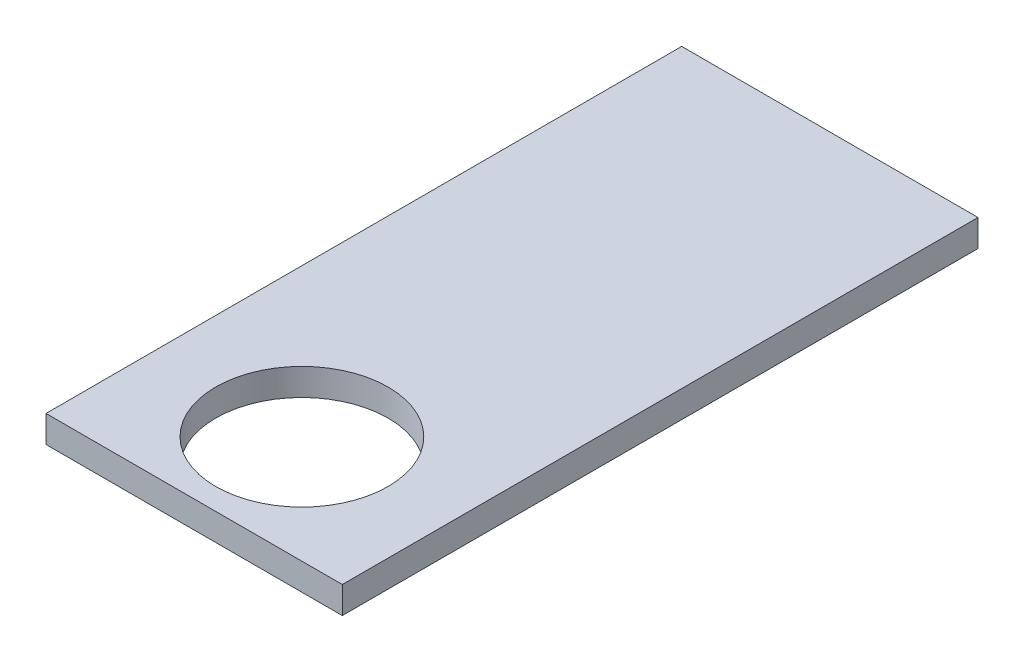
ISO-10303-21;
HEADER;
FILE_DESCRIPTION(('STEP AP214'),'2;1');
FILE_NAME('part.step','',(''),(''),'','','');
FILE_SCHEMA(('AUTOMOTIVE_DESIGN { 1 0 10303 214 1 1 1 1 }'));
ENDSEC;
DATA;
#1=APPLICATION_CONTEXT('core data for automotive mechanical design processes');
#2=APPLICATION_PROTOCOL_DEFINITION('international standard','automotive_design',2000,#1);
#3=PRODUCT_CONTEXT('',#1,'mechanical');
#4=PRODUCT('Part','Part','',(#3));
#5=PRODUCT_RELATED_PRODUCT_CATEGORY('part','',(#4));
#6=PRODUCT_DEFINITION_FORMATION('','',#4);
#7=PRODUCT_DEFINITION_CONTEXT('part definition',#1,'design');
#8=PRODUCT_DEFINITION('design','',#6,#7);
#9=PRODUCT_DEFINITION_SHAPE('','',#8);
#10=(LENGTH_UNIT() NAMED_UNIT(*) SI_UNIT(.MILLI.,.METRE.));
#11=(NAMED_UNIT(*) PLANE_ANGLE_UNIT() SI_UNIT($,.RADIAN.));
#12=(NAMED_UNIT(*) SI_UNIT($,.STERADIAN.) SOLID_ANGLE_UNIT());
#13=UNCERTAINTY_MEASURE_WITH_UNIT(LENGTH_MEASURE(1.E-05),#10,'distance_accuracy_value','');
#14=(GEOMETRIC_REPRESENTATION_CONTEXT(3) GLOBAL_UNCERTAINTY_ASSIGNED_CONTEXT((#13)) GLOBAL_UNIT_ASSIGNED_CONTEXT((#10,
#11,#12)) REPRESENTATION_CONTEXT('',''));
#15=CARTESIAN_POINT('',(0.,0.,0.));
#16=DIRECTION('',(0.,0.,1.));
#17=DIRECTION('',(1.,0.,0.));
#18=AXIS2_PLACEMENT_3D('',#15,#16,#17);
#19=CARTESIAN_POINT('',(0.,5.,0.));
#20=DIRECTION('',(0.,1.,0.));
#21=DIRECTION('',(0.,0.,1.));
#22=AXIS2_PLACEMENT_3D('',#19,#20,#21);
#23=PLANE('',#22);
#24=DIRECTION('',(0.,0.,-1.));
#25=VECTOR('',#24,1.);
#26=CARTESIAN_POINT('',(27.5,5.,-59.));
#27=LINE('',#26,#25);
#28=CARTESIAN_POINT('',(27.5,5.,59.));
#29=VERTEX_POINT('',#28);
#30=CARTESIAN_POINT('',(27.5,5.,-59.));
#31=VERTEX_POINT('',#30);
#32=EDGE_CURVE('E92',#29,#31,#27,.T.);
#33=ORIENTED_EDGE('',*,*,#32,.T.);
#34=DIRECTION('',(-1.,0.,0.));
#35=VECTOR('',#34,1.);
#36=CARTESIAN_POINT('',(-27.5,5.,-59.));
#37=LINE('',#36,#35);
#38=CARTESIAN_POINT('',(-27.5,5.,-59.));
#39=VERTEX_POINT('',#38);
#40=EDGE_CURVE('E87',#31,#39,#37,.T.);
#41=ORIENTED_EDGE('',*,*,#40,.T.);
#42=DIRECTION('',(0.,0.,1.));
#43=VECTOR('',#42,1.);
#44=CARTESIAN_POINT('',(-27.5,5.,-59.));
#45=LINE('',#44,#43);
#46=CARTESIAN_POINT('',(-27.5,5.,59.));
#47=VERTEX_POINT('',#46);
#48=EDGE_CURVE('E90',#39,#47,#45,.T.);
#49=ORIENTED_EDGE('',*,*,#48,.T.);
#50=DIRECTION('',(1.,0.,0.));
#51=VECTOR('',#50,1.);
#52=CARTESIAN_POINT('',(-27.5,5.,59.));
#53=LINE('',#52,#51);
#54=EDGE_CURVE('E57',#47,#29,#53,.T.);
#55=ORIENTED_EDGE('',*,*,#54,.T.);
#56=EDGE_LOOP('',(#33,#41,#49,#55));
#57=FACE_BOUND('',#56,.T.);
#58=CARTESIAN_POINT('',(0.,5.,39.));
#59=DIRECTION('',(0.,1.,0.));
#60=DIRECTION('',(0.,0.,1.));
#61=AXIS2_PLACEMENT_3D('',#58,#59,#60);
#62=CIRCLE('',#61,16.);
#63=CARTESIAN_POINT('',(0.,5.,55.));
#64=VERTEX_POINT('',#63);
#65=EDGE_CURVE('E112',#64,#64,#62,.T.);
#66=ORIENTED_EDGE('',*,*,#65,.F.);
#67=EDGE_LOOP('',(#66));
#68=FACE_BOUND('',#67,.T.);
#69=ADVANCED_FACE('F39',(#57,#68),#23,.T.);
#70=CARTESIAN_POINT('',(0.,0.,0.));
#71=DIRECTION('',(0.,1.,0.));
#72=DIRECTION('',(0.,0.,1.));
#73=AXIS2_PLACEMENT_3D('',#70,#71,#72);
#74=PLANE('',#73);
#75=DIRECTION('',(0.,0.,-1.));
#76=VECTOR('',#75,1.);
#77=CARTESIAN_POINT('',(27.5,0.,-59.));
#78=LINE('',#77,#76);
#79=CARTESIAN_POINT('',(27.5,0.,59.));
#80=VERTEX_POINT('',#79);
#81=CARTESIAN_POINT('',(27.5,0.,-59.));
#82=VERTEX_POINT('',#81);
#83=EDGE_CURVE('E108',#80,#82,#78,.T.);
#84=ORIENTED_EDGE('',*,*,#83,.F.);
#85=DIRECTION('',(1.,0.,0.));
#86=VECTOR('',#85,1.);
#87=CARTESIAN_POINT('',(-27.5,0.,59.));
#88=LINE('',#87,#86);
#89=CARTESIAN_POINT('',(-27.5,0.,59.));
#90=VERTEX_POINT('',#89);
#91=EDGE_CURVE('E80',#90,#80,#88,.T.);
#92=ORIENTED_EDGE('',*,*,#91,.F.);
#93=DIRECTION('',(0.,0.,1.));
#94=VECTOR('',#93,1.);
#95=CARTESIAN_POINT('',(-27.5,0.,-59.));
#96=LINE('',#95,#94);
#97=CARTESIAN_POINT('',(-27.5,0.,-59.));
#98=VERTEX_POINT('',#97);
#99=EDGE_CURVE('E74',#98,#90,#96,.T.);
#100=ORIENTED_EDGE('',*,*,#99,.F.);
#101=DIRECTION('',(-1.,0.,0.));
#102=VECTOR('',#101,1.);
#103=CARTESIAN_POINT('',(-27.5,0.,-59.));
#104=LINE('',#103,#102);
#105=EDGE_CURVE('E97',#82,#98,#104,.T.);
#106=ORIENTED_EDGE('',*,*,#105,.F.);
#107=EDGE_LOOP('',(#84,#92,#100,#106));
#108=FACE_BOUND('',#107,.T.);
#109=CARTESIAN_POINT('',(0.,0.,39.));
#110=DIRECTION('',(0.,1.,0.));
#111=DIRECTION('',(0.,0.,1.));
#112=AXIS2_PLACEMENT_3D('',#109,#110,#111);
#113=CIRCLE('',#112,16.);
#114=CARTESIAN_POINT('',(0.,0.,55.));
#115=VERTEX_POINT('',#114);
#116=EDGE_CURVE('E130',#115,#115,#113,.T.);
#117=ORIENTED_EDGE('',*,*,#116,.T.);
#118=EDGE_LOOP('',(#117));
#119=FACE_BOUND('',#118,.T.);
#120=ADVANCED_FACE('F125',(#108,#119),#74,.F.);
#121=CARTESIAN_POINT('',(27.5,5.,-59.));
#122=DIRECTION('',(-1.,0.,0.));
#123=DIRECTION('',(0.,0.,1.));
#124=AXIS2_PLACEMENT_3D('',#121,#122,#123);
#125=PLANE('',#124);
#126=ORIENTED_EDGE('',*,*,#83,.T.);
#127=DIRECTION('',(0.,-1.,0.));
#128=VECTOR('',#127,1.);
#129=CARTESIAN_POINT('',(27.5,5.,-59.));
#130=LINE('',#129,#128);
#131=EDGE_CURVE('E11',#31,#82,#130,.T.);
#132=ORIENTED_EDGE('',*,*,#131,.F.);
#133=ORIENTED_EDGE('',*,*,#32,.F.);
#134=DIRECTION('',(0.,-1.,0.));
#135=VECTOR('',#134,1.);
#136=CARTESIAN_POINT('',(27.5,5.,59.));
#137=LINE('',#136,#135);
#138=EDGE_CURVE('E104',#29,#80,#137,.T.);
#139=ORIENTED_EDGE('',*,*,#138,.T.);
#140=EDGE_LOOP('',(#126,#132,#133,#139));
#141=FACE_BOUND('',#140,.T.);
#142=ADVANCED_FACE('F41',(#141),#125,.F.);
#143=CARTESIAN_POINT('',(-27.5,5.,-59.));
#144=DIRECTION('',(0.,0.,1.));
#145=DIRECTION('',(1.,0.,0.));
#146=AXIS2_PLACEMENT_3D('',#143,#144,#145);
#147=PLANE('',#146);
#148=ORIENTED_EDGE('',*,*,#105,.T.);
#149=DIRECTION('',(0.,-1.,0.));
#150=VECTOR('',#149,1.);
#151=CARTESIAN_POINT('',(-27.5,5.,-59.));
#152=LINE('',#151,#150);
#153=EDGE_CURVE('E49',#39,#98,#152,.T.);
#154=ORIENTED_EDGE('',*,*,#153,.F.);
#155=ORIENTED_EDGE('',*,*,#40,.F.);
#156=ORIENTED_EDGE('',*,*,#131,.T.);
#157=EDGE_LOOP('',(#148,#154,#155,#156));
#158=FACE_BOUND('',#157,.T.);
#159=ADVANCED_FACE('F96',(#158),#147,.F.);
#160=CARTESIAN_POINT('',(-27.5,5.,-59.));
#161=DIRECTION('',(1.,0.,0.));
#162=DIRECTION('',(0.,0.,-1.));
#163=AXIS2_PLACEMENT_3D('',#160,#161,#162);
#164=PLANE('',#163);
#165=ORIENTED_EDGE('',*,*,#99,.T.);
#166=DIRECTION('',(0.,-1.,0.));
#167=VECTOR('',#166,1.);
#168=CARTESIAN_POINT('',(-27.5,5.,59.));
#169=LINE('',#168,#167);
#170=EDGE_CURVE('E99',#47,#90,#169,.T.);
#171=ORIENTED_EDGE('',*,*,#170,.F.);
#172=ORIENTED_EDGE('',*,*,#48,.F.);
#173=ORIENTED_EDGE('',*,*,#153,.T.);
#174=EDGE_LOOP('',(#165,#171,#172,#173));
#175=FACE_BOUND('',#174,.T.);
#176=ADVANCED_FACE('F100',(#175),#164,.F.);
#177=CARTESIAN_POINT('',(-27.5,5.,59.));
#178=DIRECTION('',(0.,0.,-1.));
#179=DIRECTION('',(-1.,0.,0.));
#180=AXIS2_PLACEMENT_3D('',#177,#178,#179);
#181=PLANE('',#180);
#182=ORIENTED_EDGE('',*,*,#91,.T.);
#183=ORIENTED_EDGE('',*,*,#138,.F.);
#184=ORIENTED_EDGE('',*,*,#54,.F.);
#185=ORIENTED_EDGE('',*,*,#170,.T.);
#186=EDGE_LOOP('',(#182,#183,#184,#185));
#187=FACE_BOUND('',#186,.T.);
#188=ADVANCED_FACE('F122',(#187),#181,.F.);
#189=CARTESIAN_POINT('',(0.,5.,39.));
#190=DIRECTION('',(0.,-1.,0.));
#191=DIRECTION('',(0.,0.,-1.));
#192=AXIS2_PLACEMENT_3D('',#189,#190,#191);
#193=CYLINDRICAL_SURFACE('',#192,16.);
#194=ORIENTED_EDGE('',*,*,#65,.T.);
#195=EDGE_LOOP('',(#194));
#196=FACE_BOUND('',#195,.T.);
#197=ORIENTED_EDGE('',*,*,#116,.F.);
#198=EDGE_LOOP('',(#197));
#199=FACE_BOUND('',#198,.T.);
#200=ADVANCED_FACE('F138',(#196,#199),#193,.F.);
#201=CLOSED_SHELL('',(#69,#120,#142,#159,#176,#188,#200));
#202=MANIFOLD_SOLID_BREP('B2',#201);
#203=ADVANCED_BREP_SHAPE_REPRESENTATION('',(#18,#202),#14);
#204=SHAPE_DEFINITION_REPRESENTATION(#9,#203);
ENDSEC;
END-ISO-10303-21;
